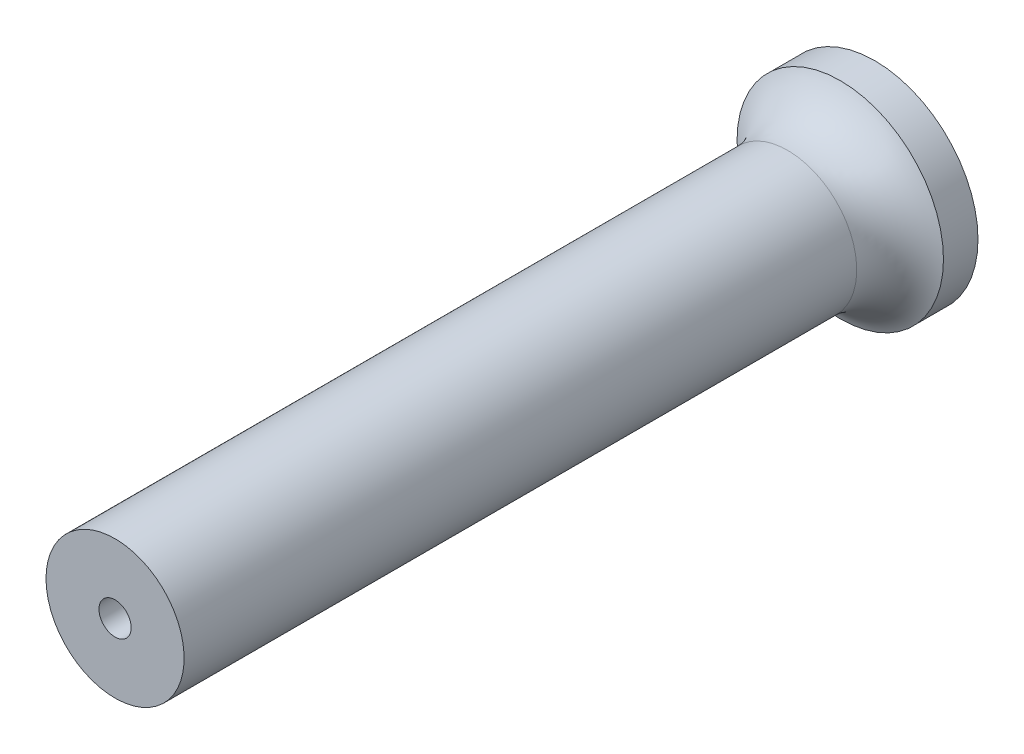
ISO-10303-21;
HEADER;
FILE_DESCRIPTION(('STEP AP214'),'2;1');
FILE_NAME('part.step','',(''),(''),'','','');
FILE_SCHEMA(('AUTOMOTIVE_DESIGN { 1 0 10303 214 1 1 1 1 }'));
ENDSEC;
DATA;
#1=APPLICATION_CONTEXT('core data for automotive mechanical design processes');
#2=APPLICATION_PROTOCOL_DEFINITION('international standard','automotive_design',2000,#1);
#3=PRODUCT_CONTEXT('',#1,'mechanical');
#4=PRODUCT('Part','Part','',(#3));
#5=PRODUCT_RELATED_PRODUCT_CATEGORY('part','',(#4));
#6=PRODUCT_DEFINITION_FORMATION('','',#4);
#7=PRODUCT_DEFINITION_CONTEXT('part definition',#1,'design');
#8=PRODUCT_DEFINITION('design','',#6,#7);
#9=PRODUCT_DEFINITION_SHAPE('','',#8);
#10=(LENGTH_UNIT() NAMED_UNIT(*) SI_UNIT(.MILLI.,.METRE.));
#11=(NAMED_UNIT(*) PLANE_ANGLE_UNIT() SI_UNIT($,.RADIAN.));
#12=(NAMED_UNIT(*) SI_UNIT($,.STERADIAN.) SOLID_ANGLE_UNIT());
#13=UNCERTAINTY_MEASURE_WITH_UNIT(LENGTH_MEASURE(1.E-05),#10,'distance_accuracy_value','');
#14=(GEOMETRIC_REPRESENTATION_CONTEXT(3) GLOBAL_UNCERTAINTY_ASSIGNED_CONTEXT((#13)) GLOBAL_UNIT_ASSIGNED_CONTEXT((#10,
#11,#12)) REPRESENTATION_CONTEXT('',''));
#15=CARTESIAN_POINT('',(0.,0.,0.));
#16=DIRECTION('',(0.,0.,1.));
#17=DIRECTION('',(1.,0.,0.));
#18=AXIS2_PLACEMENT_3D('',#15,#16,#17);
#19=CARTESIAN_POINT('',(150.771693646765,87.3524805948505,0.));
#20=DIRECTION('',(0.,0.,1.));
#21=DIRECTION('',(1.,0.,0.));
#22=AXIS2_PLACEMENT_3D('',#19,#20,#21);
#23=PLANE('',#22);
#24=CARTESIAN_POINT('',(150.771693646765,87.3524805948505,0.));
#25=DIRECTION('',(0.,0.,1.));
#26=DIRECTION('',(1.,0.,0.));
#27=AXIS2_PLACEMENT_3D('',#24,#25,#26);
#28=CIRCLE('',#27,8.96601630766314);
#29=CARTESIAN_POINT('',(159.737709954428,87.3524805948505,0.));
#30=VERTEX_POINT('',#29);
#31=EDGE_CURVE('E42',#30,#30,#28,.T.);
#32=ORIENTED_EDGE('',*,*,#31,.F.);
#33=EDGE_LOOP('',(#32));
#34=FACE_BOUND('',#33,.T.);
#35=CARTESIAN_POINT('',(150.771693646765,87.3524805948505,0.));
#36=DIRECTION('',(0.,0.,1.));
#37=DIRECTION('',(1.,0.,0.));
#38=AXIS2_PLACEMENT_3D('',#35,#36,#37);
#39=CIRCLE('',#38,1.4);
#40=CARTESIAN_POINT('',(152.171693646765,87.3524805948505,0.));
#41=VERTEX_POINT('',#40);
#42=EDGE_CURVE('E47',#41,#41,#39,.T.);
#43=ORIENTED_EDGE('',*,*,#42,.T.);
#44=EDGE_LOOP('',(#43));
#45=FACE_BOUND('',#44,.T.);
#46=ADVANCED_FACE('F31',(#34,#45),#23,.F.);
#47=CARTESIAN_POINT('',(150.771693646765,87.3524805948505,3.));
#48=DIRECTION('',(0.,0.,-1.));
#49=DIRECTION('',(-1.,0.,0.));
#50=AXIS2_PLACEMENT_3D('',#47,#48,#49);
#51=CYLINDRICAL_SURFACE('',#50,8.96601630766314);
#52=CARTESIAN_POINT('',(150.771693646765,87.3524805948505,3.));
#53=DIRECTION('',(0.,0.,1.));
#54=DIRECTION('',(1.,0.,0.));
#55=AXIS2_PLACEMENT_3D('',#52,#53,#54);
#56=CIRCLE('',#55,8.96601630766314);
#57=CARTESIAN_POINT('',(159.737709954428,87.3524805948505,3.));
#58=VERTEX_POINT('',#57);
#59=EDGE_CURVE('E38',#58,#58,#56,.T.);
#60=ORIENTED_EDGE('',*,*,#59,.F.);
#61=EDGE_LOOP('',(#60));
#62=FACE_BOUND('',#61,.T.);
#63=ORIENTED_EDGE('',*,*,#31,.T.);
#64=EDGE_LOOP('',(#63));
#65=FACE_BOUND('',#64,.T.);
#66=ADVANCED_FACE('F64',(#62,#65),#51,.T.);
#67=CARTESIAN_POINT('',(150.771693646765,87.3524805948505,3.));
#68=DIRECTION('',(0.,0.,-1.));
#69=DIRECTION('',(-1.,0.,0.));
#70=AXIS2_PLACEMENT_3D('',#67,#68,#69);
#71=CYLINDRICAL_SURFACE('',#70,1.4);
#72=ORIENTED_EDGE('',*,*,#42,.F.);
#73=EDGE_LOOP('',(#72));
#74=FACE_BOUND('',#73,.T.);
#75=CARTESIAN_POINT('',(150.771693646765,87.3524805948505,66.));
#76=DIRECTION('',(0.,0.,-1.));
#77=DIRECTION('',(-1.,0.,0.));
#78=AXIS2_PLACEMENT_3D('',#75,#76,#77);
#79=CIRCLE('',#78,1.4);
#80=CARTESIAN_POINT('',(149.371693646765,87.3524805948505,66.));
#81=VERTEX_POINT('',#80);
#82=EDGE_CURVE('E54',#81,#81,#79,.T.);
#83=ORIENTED_EDGE('',*,*,#82,.F.);
#84=EDGE_LOOP('',(#83));
#85=FACE_BOUND('',#84,.T.);
#86=ADVANCED_FACE('F61',(#74,#85),#71,.F.);
#87=CARTESIAN_POINT('',(150.771693646765,87.3524805948505,66.));
#88=DIRECTION('',(0.,0.,-1.));
#89=DIRECTION('',(-1.,0.,0.));
#90=AXIS2_PLACEMENT_3D('',#87,#88,#89);
#91=CYLINDRICAL_SURFACE('',#90,6.00000000000002);
#92=CARTESIAN_POINT('',(150.771693646765,87.3524805948505,7.56759349540955));
#93=DIRECTION('',(0.,0.,-1.));
#94=DIRECTION('',(-1.,0.,0.));
#95=AXIS2_PLACEMENT_3D('',#92,#93,#94);
#96=CIRCLE('',#95,6.00000000000002);
#97=CARTESIAN_POINT('',(144.771693646765,87.3524805948505,7.56759349540955));
#98=VERTEX_POINT('',#97);
#99=EDGE_CURVE('E10',#98,#98,#96,.F.);
#100=ORIENTED_EDGE('',*,*,#99,.T.);
#101=EDGE_LOOP('',(#100));
#102=FACE_BOUND('',#101,.T.);
#103=CARTESIAN_POINT('',(150.771693646765,87.3524805948505,66.));
#104=DIRECTION('',(0.,0.,-1.));
#105=DIRECTION('',(-1.,0.,0.));
#106=AXIS2_PLACEMENT_3D('',#103,#104,#105);
#107=CIRCLE('',#106,6.00000000000002);
#108=CARTESIAN_POINT('',(144.771693646765,87.3524805948505,66.));
#109=VERTEX_POINT('',#108);
#110=EDGE_CURVE('E51',#109,#109,#107,.T.);
#111=ORIENTED_EDGE('',*,*,#110,.T.);
#112=EDGE_LOOP('',(#111));
#113=FACE_BOUND('',#112,.T.);
#114=ADVANCED_FACE('F63',(#102,#113),#91,.T.);
#115=CARTESIAN_POINT('',(150.771693646765,87.3524805948505,66.));
#116=DIRECTION('',(0.,0.,-1.));
#117=DIRECTION('',(-1.,0.,0.));
#118=AXIS2_PLACEMENT_3D('',#115,#116,#117);
#119=PLANE('',#118);
#120=ORIENTED_EDGE('',*,*,#82,.T.);
#121=EDGE_LOOP('',(#120));
#122=FACE_BOUND('',#121,.T.);
#123=ORIENTED_EDGE('',*,*,#110,.F.);
#124=EDGE_LOOP('',(#123));
#125=FACE_BOUND('',#124,.T.);
#126=ADVANCED_FACE('F58',(#122,#125),#119,.F.);
#127=CARTESIAN_POINT('',(150.771693646765,87.3524805948505,7.56759349540955));
#128=DIRECTION('',(0.,0.,-1.));
#129=DIRECTION('',(-1.,0.,0.));
#130=AXIS2_PLACEMENT_3D('',#127,#128,#129);
#131=TOROIDAL_SURFACE('',#130,11.,5.);
#132=ORIENTED_EDGE('',*,*,#59,.T.);
#133=EDGE_LOOP('',(#132));
#134=FACE_BOUND('',#133,.T.);
#135=ORIENTED_EDGE('',*,*,#99,.F.);
#136=EDGE_LOOP('',(#135));
#137=FACE_BOUND('',#136,.T.);
#138=ADVANCED_FACE('F33',(#134,#137),#131,.F.);
#139=CLOSED_SHELL('',(#46,#66,#86,#114,#126,#138));
#140=MANIFOLD_SOLID_BREP('B2',#139);
#141=ADVANCED_BREP_SHAPE_REPRESENTATION('',(#18,#140),#14);
#142=SHAPE_DEFINITION_REPRESENTATION(#9,#141);
ENDSEC;
END-ISO-10303-21;
